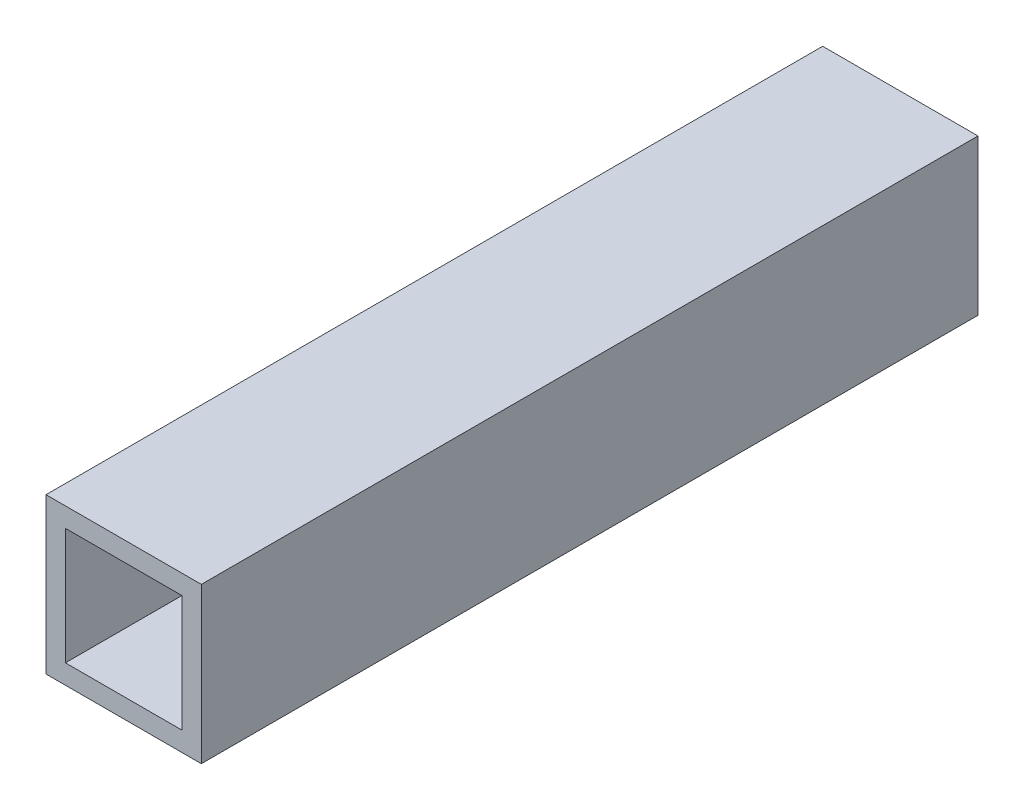
ISO-10303-21;
HEADER;
FILE_DESCRIPTION(('STEP AP214'),'2;1');
FILE_NAME('part.step','',(''),(''),'','','');
FILE_SCHEMA(('AUTOMOTIVE_DESIGN { 1 0 10303 214 1 1 1 1 }'));
ENDSEC;
DATA;
#1=APPLICATION_CONTEXT('core data for automotive mechanical design processes');
#2=APPLICATION_PROTOCOL_DEFINITION('international standard','automotive_design',2000,#1);
#3=PRODUCT_CONTEXT('',#1,'mechanical');
#4=PRODUCT('Part','Part','',(#3));
#5=PRODUCT_RELATED_PRODUCT_CATEGORY('part','',(#4));
#6=PRODUCT_DEFINITION_FORMATION('','',#4);
#7=PRODUCT_DEFINITION_CONTEXT('part definition',#1,'design');
#8=PRODUCT_DEFINITION('design','',#6,#7);
#9=PRODUCT_DEFINITION_SHAPE('','',#8);
#10=(LENGTH_UNIT() NAMED_UNIT(*) SI_UNIT(.MILLI.,.METRE.));
#11=(NAMED_UNIT(*) PLANE_ANGLE_UNIT() SI_UNIT($,.RADIAN.));
#12=(NAMED_UNIT(*) SI_UNIT($,.STERADIAN.) SOLID_ANGLE_UNIT());
#13=UNCERTAINTY_MEASURE_WITH_UNIT(LENGTH_MEASURE(1.E-05),#10,'distance_accuracy_value','');
#14=(GEOMETRIC_REPRESENTATION_CONTEXT(3) GLOBAL_UNCERTAINTY_ASSIGNED_CONTEXT((#13)) GLOBAL_UNIT_ASSIGNED_CONTEXT((#10,
#11,#12)) REPRESENTATION_CONTEXT('',''));
#15=CARTESIAN_POINT('',(0.,0.,0.));
#16=DIRECTION('',(0.,0.,1.));
#17=DIRECTION('',(1.,0.,0.));
#18=AXIS2_PLACEMENT_3D('',#15,#16,#17);
#19=CARTESIAN_POINT('',(0.,0.,127.));
#20=DIRECTION('',(0.,0.,1.));
#21=DIRECTION('',(1.,0.,0.));
#22=AXIS2_PLACEMENT_3D('',#19,#20,#21);
#23=PLANE('',#22);
#24=DIRECTION('',(0.,1.,0.));
#25=VECTOR('',#24,1.);
#26=CARTESIAN_POINT('',(12.7,12.7,127.));
#27=LINE('',#26,#25);
#28=CARTESIAN_POINT('',(12.7,-12.7,127.));
#29=VERTEX_POINT('',#28);
#30=CARTESIAN_POINT('',(12.7,12.7,127.));
#31=VERTEX_POINT('',#30);
#32=EDGE_CURVE('E153',#29,#31,#27,.T.);
#33=ORIENTED_EDGE('',*,*,#32,.T.);
#34=DIRECTION('',(-1.,0.,0.));
#35=VECTOR('',#34,1.);
#36=CARTESIAN_POINT('',(-12.7,12.7,127.));
#37=LINE('',#36,#35);
#38=CARTESIAN_POINT('',(-12.7,12.7,127.));
#39=VERTEX_POINT('',#38);
#40=EDGE_CURVE('E157',#31,#39,#37,.T.);
#41=ORIENTED_EDGE('',*,*,#40,.T.);
#42=DIRECTION('',(0.,-1.,0.));
#43=VECTOR('',#42,1.);
#44=CARTESIAN_POINT('',(-12.7,12.7,127.));
#45=LINE('',#44,#43);
#46=CARTESIAN_POINT('',(-12.7,-12.7,127.));
#47=VERTEX_POINT('',#46);
#48=EDGE_CURVE('E161',#39,#47,#45,.T.);
#49=ORIENTED_EDGE('',*,*,#48,.T.);
#50=DIRECTION('',(1.,0.,0.));
#51=VECTOR('',#50,1.);
#52=CARTESIAN_POINT('',(-12.7,-12.7,127.));
#53=LINE('',#52,#51);
#54=EDGE_CURVE('E164',#47,#29,#53,.T.);
#55=ORIENTED_EDGE('',*,*,#54,.T.);
#56=EDGE_LOOP('',(#33,#41,#49,#55));
#57=FACE_BOUND('',#56,.T.);
#58=DIRECTION('',(-1.,0.,0.));
#59=VECTOR('',#58,1.);
#60=CARTESIAN_POINT('',(-9.525,9.525,127.));
#61=LINE('',#60,#59);
#62=CARTESIAN_POINT('',(9.52500000000001,9.525,127.));
#63=VERTEX_POINT('',#62);
#64=CARTESIAN_POINT('',(-9.525,9.525,127.));
#65=VERTEX_POINT('',#64);
#66=EDGE_CURVE('E114',#63,#65,#61,.T.);
#67=ORIENTED_EDGE('',*,*,#66,.F.);
#68=DIRECTION('',(0.,1.,0.));
#69=VECTOR('',#68,1.);
#70=CARTESIAN_POINT('',(9.52500000000001,9.525,127.));
#71=LINE('',#70,#69);
#72=CARTESIAN_POINT('',(9.52500000000001,-9.525,127.));
#73=VERTEX_POINT('',#72);
#74=EDGE_CURVE('E105',#73,#63,#71,.T.);
#75=ORIENTED_EDGE('',*,*,#74,.F.);
#76=DIRECTION('',(1.,0.,0.));
#77=VECTOR('',#76,1.);
#78=CARTESIAN_POINT('',(-9.525,-9.525,127.));
#79=LINE('',#78,#77);
#80=CARTESIAN_POINT('',(-9.525,-9.525,127.));
#81=VERTEX_POINT('',#80);
#82=EDGE_CURVE('E131',#81,#73,#79,.T.);
#83=ORIENTED_EDGE('',*,*,#82,.F.);
#84=DIRECTION('',(0.,-1.,0.));
#85=VECTOR('',#84,1.);
#86=CARTESIAN_POINT('',(-9.525,9.525,127.));
#87=LINE('',#86,#85);
#88=EDGE_CURVE('E127',#65,#81,#87,.T.);
#89=ORIENTED_EDGE('',*,*,#88,.F.);
#90=EDGE_LOOP('',(#67,#75,#83,#89));
#91=FACE_BOUND('',#90,.T.);
#92=ADVANCED_FACE('F39',(#57,#91),#23,.T.);
#93=CARTESIAN_POINT('',(0.,0.,0.));
#94=DIRECTION('',(0.,0.,1.));
#95=DIRECTION('',(1.,0.,0.));
#96=AXIS2_PLACEMENT_3D('',#93,#94,#95);
#97=PLANE('',#96);
#98=DIRECTION('',(0.,1.,0.));
#99=VECTOR('',#98,1.);
#100=CARTESIAN_POINT('',(12.7,12.7,0.));
#101=LINE('',#100,#99);
#102=CARTESIAN_POINT('',(12.7,-12.7,0.));
#103=VERTEX_POINT('',#102);
#104=CARTESIAN_POINT('',(12.7,12.7,0.));
#105=VERTEX_POINT('',#104);
#106=EDGE_CURVE('E123',#103,#105,#101,.T.);
#107=ORIENTED_EDGE('',*,*,#106,.F.);
#108=DIRECTION('',(1.,0.,0.));
#109=VECTOR('',#108,1.);
#110=CARTESIAN_POINT('',(-12.7,-12.7,0.));
#111=LINE('',#110,#109);
#112=CARTESIAN_POINT('',(-12.7,-12.7,0.));
#113=VERTEX_POINT('',#112);
#114=EDGE_CURVE('E158',#113,#103,#111,.T.);
#115=ORIENTED_EDGE('',*,*,#114,.F.);
#116=DIRECTION('',(0.,-1.,0.));
#117=VECTOR('',#116,1.);
#118=CARTESIAN_POINT('',(-12.7,12.7,0.));
#119=LINE('',#118,#117);
#120=CARTESIAN_POINT('',(-12.7,12.7,0.));
#121=VERTEX_POINT('',#120);
#122=EDGE_CURVE('E174',#121,#113,#119,.T.);
#123=ORIENTED_EDGE('',*,*,#122,.F.);
#124=DIRECTION('',(-1.,0.,0.));
#125=VECTOR('',#124,1.);
#126=CARTESIAN_POINT('',(-12.7,12.7,0.));
#127=LINE('',#126,#125);
#128=EDGE_CURVE('E171',#105,#121,#127,.T.);
#129=ORIENTED_EDGE('',*,*,#128,.F.);
#130=EDGE_LOOP('',(#107,#115,#123,#129));
#131=FACE_BOUND('',#130,.T.);
#132=DIRECTION('',(0.,1.,0.));
#133=VECTOR('',#132,1.);
#134=CARTESIAN_POINT('',(9.52500000000001,9.525,0.));
#135=LINE('',#134,#133);
#136=CARTESIAN_POINT('',(9.52500000000001,-9.525,0.));
#137=VERTEX_POINT('',#136);
#138=CARTESIAN_POINT('',(9.52500000000001,9.525,0.));
#139=VERTEX_POINT('',#138);
#140=EDGE_CURVE('E63',#137,#139,#135,.T.);
#141=ORIENTED_EDGE('',*,*,#140,.T.);
#142=DIRECTION('',(-1.,0.,0.));
#143=VECTOR('',#142,1.);
#144=CARTESIAN_POINT('',(-9.525,9.525,0.));
#145=LINE('',#144,#143);
#146=CARTESIAN_POINT('',(-9.525,9.525,0.));
#147=VERTEX_POINT('',#146);
#148=EDGE_CURVE('E121',#139,#147,#145,.T.);
#149=ORIENTED_EDGE('',*,*,#148,.T.);
#150=DIRECTION('',(0.,-1.,0.));
#151=VECTOR('',#150,1.);
#152=CARTESIAN_POINT('',(-9.525,9.525,0.));
#153=LINE('',#152,#151);
#154=CARTESIAN_POINT('',(-9.525,-9.525,0.));
#155=VERTEX_POINT('',#154);
#156=EDGE_CURVE('E140',#147,#155,#153,.T.);
#157=ORIENTED_EDGE('',*,*,#156,.T.);
#158=DIRECTION('',(1.,0.,0.));
#159=VECTOR('',#158,1.);
#160=CARTESIAN_POINT('',(-9.525,-9.525,0.));
#161=LINE('',#160,#159);
#162=EDGE_CURVE('E115',#155,#137,#161,.T.);
#163=ORIENTED_EDGE('',*,*,#162,.T.);
#164=EDGE_LOOP('',(#141,#149,#157,#163));
#165=FACE_BOUND('',#164,.T.);
#166=ADVANCED_FACE('F197',(#131,#165),#97,.F.);
#167=CARTESIAN_POINT('',(12.7,12.7,127.));
#168=DIRECTION('',(-1.,0.,0.));
#169=DIRECTION('',(0.,-1.,0.));
#170=AXIS2_PLACEMENT_3D('',#167,#168,#169);
#171=PLANE('',#170);
#172=ORIENTED_EDGE('',*,*,#106,.T.);
#173=DIRECTION('',(0.,0.,-1.));
#174=VECTOR('',#173,1.);
#175=CARTESIAN_POINT('',(12.7,12.7,127.));
#176=LINE('',#175,#174);
#177=EDGE_CURVE('E11',#31,#105,#176,.T.);
#178=ORIENTED_EDGE('',*,*,#177,.F.);
#179=ORIENTED_EDGE('',*,*,#32,.F.);
#180=DIRECTION('',(0.,0.,-1.));
#181=VECTOR('',#180,1.);
#182=CARTESIAN_POINT('',(12.7,-12.7,127.));
#183=LINE('',#182,#181);
#184=EDGE_CURVE('E167',#29,#103,#183,.T.);
#185=ORIENTED_EDGE('',*,*,#184,.T.);
#186=EDGE_LOOP('',(#172,#178,#179,#185));
#187=FACE_BOUND('',#186,.T.);
#188=ADVANCED_FACE('F41',(#187),#171,.F.);
#189=CARTESIAN_POINT('',(-12.7,12.7,127.));
#190=DIRECTION('',(0.,-1.,0.));
#191=DIRECTION('',(1.,0.,0.));
#192=AXIS2_PLACEMENT_3D('',#189,#190,#191);
#193=PLANE('',#192);
#194=ORIENTED_EDGE('',*,*,#128,.T.);
#195=DIRECTION('',(0.,0.,-1.));
#196=VECTOR('',#195,1.);
#197=CARTESIAN_POINT('',(-12.7,12.7,127.));
#198=LINE('',#197,#196);
#199=EDGE_CURVE('E48',#39,#121,#198,.T.);
#200=ORIENTED_EDGE('',*,*,#199,.F.);
#201=ORIENTED_EDGE('',*,*,#40,.F.);
#202=ORIENTED_EDGE('',*,*,#177,.T.);
#203=EDGE_LOOP('',(#194,#200,#201,#202));
#204=FACE_BOUND('',#203,.T.);
#205=ADVANCED_FACE('F207',(#204),#193,.F.);
#206=CARTESIAN_POINT('',(-12.7,12.7,127.));
#207=DIRECTION('',(1.,0.,0.));
#208=DIRECTION('',(0.,1.,0.));
#209=AXIS2_PLACEMENT_3D('',#206,#207,#208);
#210=PLANE('',#209);
#211=ORIENTED_EDGE('',*,*,#122,.T.);
#212=DIRECTION('',(0.,0.,-1.));
#213=VECTOR('',#212,1.);
#214=CARTESIAN_POINT('',(-12.7,-12.7,127.));
#215=LINE('',#214,#213);
#216=EDGE_CURVE('E182',#47,#113,#215,.T.);
#217=ORIENTED_EDGE('',*,*,#216,.F.);
#218=ORIENTED_EDGE('',*,*,#48,.F.);
#219=ORIENTED_EDGE('',*,*,#199,.T.);
#220=EDGE_LOOP('',(#211,#217,#218,#219));
#221=FACE_BOUND('',#220,.T.);
#222=ADVANCED_FACE('F191',(#221),#210,.F.);
#223=CARTESIAN_POINT('',(-12.7,-12.7,127.));
#224=DIRECTION('',(0.,1.,0.));
#225=DIRECTION('',(0.,0.,1.));
#226=AXIS2_PLACEMENT_3D('',#223,#224,#225);
#227=PLANE('',#226);
#228=ORIENTED_EDGE('',*,*,#114,.T.);
#229=ORIENTED_EDGE('',*,*,#184,.F.);
#230=ORIENTED_EDGE('',*,*,#54,.F.);
#231=ORIENTED_EDGE('',*,*,#216,.T.);
#232=EDGE_LOOP('',(#228,#229,#230,#231));
#233=FACE_BOUND('',#232,.T.);
#234=ADVANCED_FACE('F201',(#233),#227,.F.);
#235=CARTESIAN_POINT('',(9.52500000000001,9.525,127.));
#236=DIRECTION('',(-1.,0.,0.));
#237=DIRECTION('',(0.,-1.,0.));
#238=AXIS2_PLACEMENT_3D('',#235,#236,#237);
#239=PLANE('',#238);
#240=ORIENTED_EDGE('',*,*,#140,.F.);
#241=DIRECTION('',(0.,0.,-1.));
#242=VECTOR('',#241,1.);
#243=CARTESIAN_POINT('',(9.52500000000001,-9.525,127.));
#244=LINE('',#243,#242);
#245=EDGE_CURVE('E109',#73,#137,#244,.T.);
#246=ORIENTED_EDGE('',*,*,#245,.F.);
#247=ORIENTED_EDGE('',*,*,#74,.T.);
#248=DIRECTION('',(0.,0.,-1.));
#249=VECTOR('',#248,1.);
#250=CARTESIAN_POINT('',(9.52500000000001,9.525,127.));
#251=LINE('',#250,#249);
#252=EDGE_CURVE('E108',#63,#139,#251,.T.);
#253=ORIENTED_EDGE('',*,*,#252,.T.);
#254=EDGE_LOOP('',(#240,#246,#247,#253));
#255=FACE_BOUND('',#254,.T.);
#256=ADVANCED_FACE('F107',(#255),#239,.T.);
#257=CARTESIAN_POINT('',(-9.525,9.525,127.));
#258=DIRECTION('',(0.,-1.,0.));
#259=DIRECTION('',(1.,0.,0.));
#260=AXIS2_PLACEMENT_3D('',#257,#258,#259);
#261=PLANE('',#260);
#262=ORIENTED_EDGE('',*,*,#148,.F.);
#263=ORIENTED_EDGE('',*,*,#252,.F.);
#264=ORIENTED_EDGE('',*,*,#66,.T.);
#265=DIRECTION('',(0.,0.,-1.));
#266=VECTOR('',#265,1.);
#267=CARTESIAN_POINT('',(-9.525,9.525,127.));
#268=LINE('',#267,#266);
#269=EDGE_CURVE('E124',#65,#147,#268,.T.);
#270=ORIENTED_EDGE('',*,*,#269,.T.);
#271=EDGE_LOOP('',(#262,#263,#264,#270));
#272=FACE_BOUND('',#271,.T.);
#273=ADVANCED_FACE('F118',(#272),#261,.T.);
#274=CARTESIAN_POINT('',(-9.525,9.525,127.));
#275=DIRECTION('',(1.,0.,0.));
#276=DIRECTION('',(0.,1.,0.));
#277=AXIS2_PLACEMENT_3D('',#274,#275,#276);
#278=PLANE('',#277);
#279=ORIENTED_EDGE('',*,*,#156,.F.);
#280=ORIENTED_EDGE('',*,*,#269,.F.);
#281=ORIENTED_EDGE('',*,*,#88,.T.);
#282=DIRECTION('',(0.,0.,-1.));
#283=VECTOR('',#282,1.);
#284=CARTESIAN_POINT('',(-9.525,-9.525,127.));
#285=LINE('',#284,#283);
#286=EDGE_CURVE('E55',#81,#155,#285,.T.);
#287=ORIENTED_EDGE('',*,*,#286,.T.);
#288=EDGE_LOOP('',(#279,#280,#281,#287));
#289=FACE_BOUND('',#288,.T.);
#290=ADVANCED_FACE('F230',(#289),#278,.T.);
#291=CARTESIAN_POINT('',(-9.525,-9.525,127.));
#292=DIRECTION('',(0.,1.,0.));
#293=DIRECTION('',(0.,0.,1.));
#294=AXIS2_PLACEMENT_3D('',#291,#292,#293);
#295=PLANE('',#294);
#296=ORIENTED_EDGE('',*,*,#162,.F.);
#297=ORIENTED_EDGE('',*,*,#286,.F.);
#298=ORIENTED_EDGE('',*,*,#82,.T.);
#299=ORIENTED_EDGE('',*,*,#245,.T.);
#300=EDGE_LOOP('',(#296,#297,#298,#299));
#301=FACE_BOUND('',#300,.T.);
#302=ADVANCED_FACE('F234',(#301),#295,.T.);
#303=CLOSED_SHELL('',(#92,#166,#188,#205,#222,#234,#256,#273,#290,#302));
#304=MANIFOLD_SOLID_BREP('B2',#303);
#305=ADVANCED_BREP_SHAPE_REPRESENTATION('',(#18,#304),#14);
#306=SHAPE_DEFINITION_REPRESENTATION(#9,#305);
ENDSEC;
END-ISO-10303-21;
